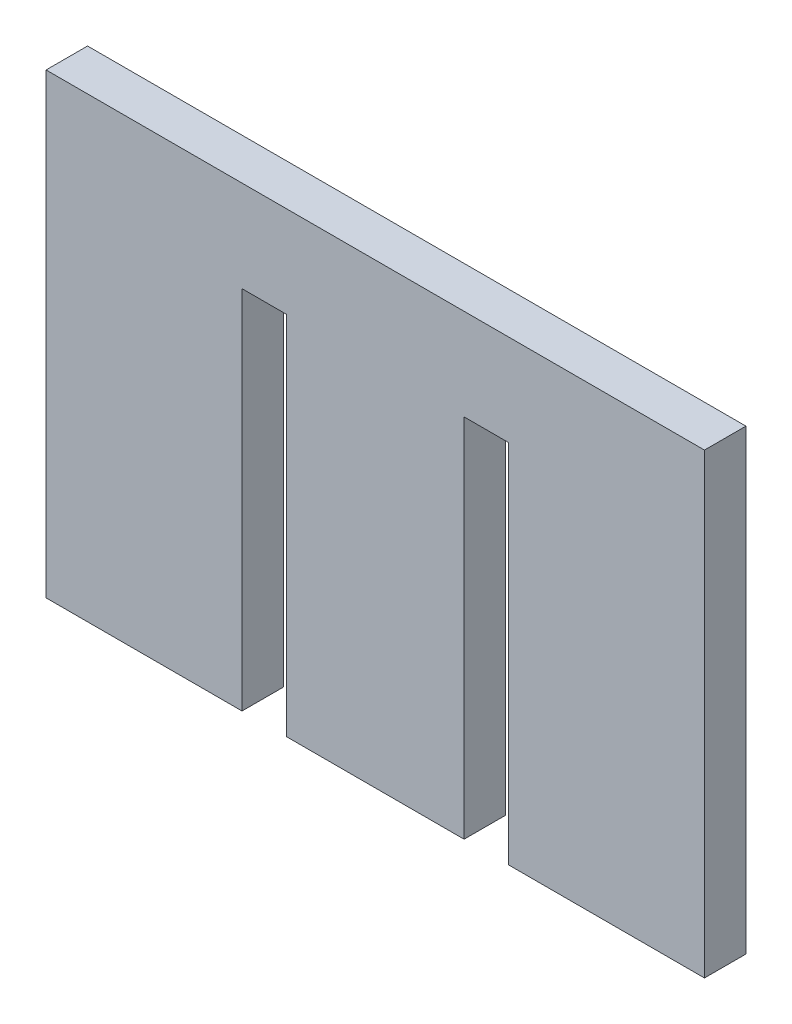
ISO-10303-21;
HEADER;
FILE_DESCRIPTION(('STEP AP214'),'2;1');
FILE_NAME('part.step','',(''),(''),'','','');
FILE_SCHEMA(('AUTOMOTIVE_DESIGN { 1 0 10303 214 1 1 1 1 }'));
ENDSEC;
DATA;
#1=APPLICATION_CONTEXT('core data for automotive mechanical design processes');
#2=APPLICATION_PROTOCOL_DEFINITION('international standard','automotive_design',2000,#1);
#3=PRODUCT_CONTEXT('',#1,'mechanical');
#4=PRODUCT('Part','Part','',(#3));
#5=PRODUCT_RELATED_PRODUCT_CATEGORY('part','',(#4));
#6=PRODUCT_DEFINITION_FORMATION('','',#4);
#7=PRODUCT_DEFINITION_CONTEXT('part definition',#1,'design');
#8=PRODUCT_DEFINITION('design','',#6,#7);
#9=PRODUCT_DEFINITION_SHAPE('','',#8);
#10=(LENGTH_UNIT() NAMED_UNIT(*) SI_UNIT(.MILLI.,.METRE.));
#11=(NAMED_UNIT(*) PLANE_ANGLE_UNIT() SI_UNIT($,.RADIAN.));
#12=(NAMED_UNIT(*) SI_UNIT($,.STERADIAN.) SOLID_ANGLE_UNIT());
#13=UNCERTAINTY_MEASURE_WITH_UNIT(LENGTH_MEASURE(1.E-05),#10,'distance_accuracy_value','');
#14=(GEOMETRIC_REPRESENTATION_CONTEXT(3) GLOBAL_UNCERTAINTY_ASSIGNED_CONTEXT((#13)) GLOBAL_UNIT_ASSIGNED_CONTEXT((#10,
#11,#12)) REPRESENTATION_CONTEXT('',''));
#15=CARTESIAN_POINT('',(0.,0.,0.));
#16=DIRECTION('',(0.,0.,1.));
#17=DIRECTION('',(1.,0.,0.));
#18=AXIS2_PLACEMENT_3D('',#15,#16,#17);
#19=CARTESIAN_POINT('',(15.,0.,3.175));
#20=DIRECTION('',(0.,1.,0.));
#21=DIRECTION('',(0.,0.,1.));
#22=AXIS2_PLACEMENT_3D('',#19,#20,#21);
#23=PLANE('',#22);
#24=DIRECTION('',(1.,0.,0.));
#25=VECTOR('',#24,1.);
#26=CARTESIAN_POINT('',(15.,0.,0.));
#27=LINE('',#26,#25);
#28=CARTESIAN_POINT('',(0.,0.,0.));
#29=VERTEX_POINT('',#28);
#30=CARTESIAN_POINT('',(15.,0.,0.));
#31=VERTEX_POINT('',#30);
#32=EDGE_CURVE('E153',#29,#31,#27,.T.);
#33=ORIENTED_EDGE('',*,*,#32,.T.);
#34=DIRECTION('',(0.,0.,-1.));
#35=VECTOR('',#34,1.);
#36=CARTESIAN_POINT('',(15.,0.,3.175));
#37=LINE('',#36,#35);
#38=CARTESIAN_POINT('',(15.,0.,3.175));
#39=VERTEX_POINT('',#38);
#40=EDGE_CURVE('E11',#39,#31,#37,.T.);
#41=ORIENTED_EDGE('',*,*,#40,.F.);
#42=DIRECTION('',(1.,0.,0.));
#43=VECTOR('',#42,1.);
#44=CARTESIAN_POINT('',(15.,0.,3.175));
#45=LINE('',#44,#43);
#46=CARTESIAN_POINT('',(0.,0.,3.175));
#47=VERTEX_POINT('',#46);
#48=EDGE_CURVE('E175',#47,#39,#45,.T.);
#49=ORIENTED_EDGE('',*,*,#48,.F.);
#50=DIRECTION('',(0.,0.,-1.));
#51=VECTOR('',#50,1.);
#52=CARTESIAN_POINT('',(0.,0.,3.175));
#53=LINE('',#52,#51);
#54=EDGE_CURVE('E149',#47,#29,#53,.T.);
#55=ORIENTED_EDGE('',*,*,#54,.T.);
#56=EDGE_LOOP('',(#33,#41,#49,#55));
#57=FACE_BOUND('',#56,.T.);
#58=ADVANCED_FACE('F33',(#57),#23,.F.);
#59=CARTESIAN_POINT('',(15.,28.,3.175));
#60=DIRECTION('',(-1.,0.,0.));
#61=DIRECTION('',(0.,-1.,0.));
#62=AXIS2_PLACEMENT_3D('',#59,#60,#61);
#63=PLANE('',#62);
#64=DIRECTION('',(0.,1.,0.));
#65=VECTOR('',#64,1.);
#66=CARTESIAN_POINT('',(15.,28.,0.));
#67=LINE('',#66,#65);
#68=CARTESIAN_POINT('',(15.,28.,0.));
#69=VERTEX_POINT('',#68);
#70=EDGE_CURVE('E156',#31,#69,#67,.T.);
#71=ORIENTED_EDGE('',*,*,#70,.T.);
#72=DIRECTION('',(0.,0.,-1.));
#73=VECTOR('',#72,1.);
#74=CARTESIAN_POINT('',(15.,28.,3.175));
#75=LINE('',#74,#73);
#76=CARTESIAN_POINT('',(15.,28.,3.175));
#77=VERTEX_POINT('',#76);
#78=EDGE_CURVE('E41',#77,#69,#75,.T.);
#79=ORIENTED_EDGE('',*,*,#78,.F.);
#80=DIRECTION('',(0.,1.,0.));
#81=VECTOR('',#80,1.);
#82=CARTESIAN_POINT('',(15.,28.,3.175));
#83=LINE('',#82,#81);
#84=EDGE_CURVE('E104',#39,#77,#83,.T.);
#85=ORIENTED_EDGE('',*,*,#84,.F.);
#86=ORIENTED_EDGE('',*,*,#40,.T.);
#87=EDGE_LOOP('',(#71,#79,#85,#86));
#88=FACE_BOUND('',#87,.T.);
#89=ADVANCED_FACE('F253',(#88),#63,.F.);
#90=CARTESIAN_POINT('',(18.4,28.,3.175));
#91=DIRECTION('',(0.,1.,0.));
#92=DIRECTION('',(-1.,0.,0.));
#93=AXIS2_PLACEMENT_3D('',#90,#91,#92);
#94=PLANE('',#93);
#95=DIRECTION('',(1.,0.,0.));
#96=VECTOR('',#95,1.);
#97=CARTESIAN_POINT('',(18.4,28.,0.));
#98=LINE('',#97,#96);
#99=CARTESIAN_POINT('',(18.4,28.,0.));
#100=VERTEX_POINT('',#99);
#101=EDGE_CURVE('E158',#69,#100,#98,.T.);
#102=ORIENTED_EDGE('',*,*,#101,.T.);
#103=DIRECTION('',(0.,0.,-1.));
#104=VECTOR('',#103,1.);
#105=CARTESIAN_POINT('',(18.4,28.,3.175));
#106=LINE('',#105,#104);
#107=CARTESIAN_POINT('',(18.4,28.,3.175));
#108=VERTEX_POINT('',#107);
#109=EDGE_CURVE('E194',#108,#100,#106,.T.);
#110=ORIENTED_EDGE('',*,*,#109,.F.);
#111=DIRECTION('',(1.,0.,0.));
#112=VECTOR('',#111,1.);
#113=CARTESIAN_POINT('',(18.4,28.,3.175));
#114=LINE('',#113,#112);
#115=EDGE_CURVE('E202',#77,#108,#114,.T.);
#116=ORIENTED_EDGE('',*,*,#115,.F.);
#117=ORIENTED_EDGE('',*,*,#78,.T.);
#118=EDGE_LOOP('',(#102,#110,#116,#117));
#119=FACE_BOUND('',#118,.T.);
#120=ADVANCED_FACE('F200',(#119),#94,.F.);
#121=CARTESIAN_POINT('',(18.4,0.,3.175));
#122=DIRECTION('',(1.,0.,0.));
#123=DIRECTION('',(0.,0.,-1.));
#124=AXIS2_PLACEMENT_3D('',#121,#122,#123);
#125=PLANE('',#124);
#126=DIRECTION('',(0.,-1.,0.));
#127=VECTOR('',#126,1.);
#128=CARTESIAN_POINT('',(18.4,0.,0.));
#129=LINE('',#128,#127);
#130=CARTESIAN_POINT('',(18.4,0.,0.));
#131=VERTEX_POINT('',#130);
#132=EDGE_CURVE('E160',#100,#131,#129,.T.);
#133=ORIENTED_EDGE('',*,*,#132,.T.);
#134=DIRECTION('',(0.,0.,-1.));
#135=VECTOR('',#134,1.);
#136=CARTESIAN_POINT('',(18.4,0.,3.175));
#137=LINE('',#136,#135);
#138=CARTESIAN_POINT('',(18.4,0.,3.175));
#139=VERTEX_POINT('',#138);
#140=EDGE_CURVE('E191',#139,#131,#137,.T.);
#141=ORIENTED_EDGE('',*,*,#140,.F.);
#142=DIRECTION('',(0.,-1.,0.));
#143=VECTOR('',#142,1.);
#144=CARTESIAN_POINT('',(18.4,0.,3.175));
#145=LINE('',#144,#143);
#146=EDGE_CURVE('E220',#108,#139,#145,.T.);
#147=ORIENTED_EDGE('',*,*,#146,.F.);
#148=ORIENTED_EDGE('',*,*,#109,.T.);
#149=EDGE_LOOP('',(#133,#141,#147,#148));
#150=FACE_BOUND('',#149,.T.);
#151=ADVANCED_FACE('F211',(#150),#125,.F.);
#152=CARTESIAN_POINT('',(32.,0.,3.175));
#153=DIRECTION('',(0.,1.,0.));
#154=DIRECTION('',(0.,0.,1.));
#155=AXIS2_PLACEMENT_3D('',#152,#153,#154);
#156=PLANE('',#155);
#157=DIRECTION('',(1.,0.,0.));
#158=VECTOR('',#157,1.);
#159=CARTESIAN_POINT('',(32.,0.,0.));
#160=LINE('',#159,#158);
#161=CARTESIAN_POINT('',(32.,0.,0.));
#162=VERTEX_POINT('',#161);
#163=EDGE_CURVE('E162',#131,#162,#160,.T.);
#164=ORIENTED_EDGE('',*,*,#163,.T.);
#165=DIRECTION('',(0.,0.,-1.));
#166=VECTOR('',#165,1.);
#167=CARTESIAN_POINT('',(32.,0.,3.175));
#168=LINE('',#167,#166);
#169=CARTESIAN_POINT('',(32.,0.,3.175));
#170=VERTEX_POINT('',#169);
#171=EDGE_CURVE('E188',#170,#162,#168,.T.);
#172=ORIENTED_EDGE('',*,*,#171,.F.);
#173=DIRECTION('',(1.,0.,0.));
#174=VECTOR('',#173,1.);
#175=CARTESIAN_POINT('',(32.,0.,3.175));
#176=LINE('',#175,#174);
#177=EDGE_CURVE('E217',#139,#170,#176,.T.);
#178=ORIENTED_EDGE('',*,*,#177,.F.);
#179=ORIENTED_EDGE('',*,*,#140,.T.);
#180=EDGE_LOOP('',(#164,#172,#178,#179));
#181=FACE_BOUND('',#180,.T.);
#182=ADVANCED_FACE('F215',(#181),#156,.F.);
#183=CARTESIAN_POINT('',(32.,28.,3.175));
#184=DIRECTION('',(-1.,0.,0.));
#185=DIRECTION('',(0.,0.,1.));
#186=AXIS2_PLACEMENT_3D('',#183,#184,#185);
#187=PLANE('',#186);
#188=DIRECTION('',(0.,1.,0.));
#189=VECTOR('',#188,1.);
#190=CARTESIAN_POINT('',(32.,28.,0.));
#191=LINE('',#190,#189);
#192=CARTESIAN_POINT('',(32.,28.,0.));
#193=VERTEX_POINT('',#192);
#194=EDGE_CURVE('E164',#162,#193,#191,.T.);
#195=ORIENTED_EDGE('',*,*,#194,.T.);
#196=DIRECTION('',(0.,0.,-1.));
#197=VECTOR('',#196,1.);
#198=CARTESIAN_POINT('',(32.,28.,3.175));
#199=LINE('',#198,#197);
#200=CARTESIAN_POINT('',(32.,28.,3.175));
#201=VERTEX_POINT('',#200);
#202=EDGE_CURVE('E185',#201,#193,#199,.T.);
#203=ORIENTED_EDGE('',*,*,#202,.F.);
#204=DIRECTION('',(0.,1.,0.));
#205=VECTOR('',#204,1.);
#206=CARTESIAN_POINT('',(32.,28.,3.175));
#207=LINE('',#206,#205);
#208=EDGE_CURVE('E219',#170,#201,#207,.T.);
#209=ORIENTED_EDGE('',*,*,#208,.F.);
#210=ORIENTED_EDGE('',*,*,#171,.T.);
#211=EDGE_LOOP('',(#195,#203,#209,#210));
#212=FACE_BOUND('',#211,.T.);
#213=ADVANCED_FACE('F266',(#212),#187,.F.);
#214=CARTESIAN_POINT('',(35.4,28.,3.175));
#215=DIRECTION('',(0.,1.,0.));
#216=DIRECTION('',(0.,0.,1.));
#217=AXIS2_PLACEMENT_3D('',#214,#215,#216);
#218=PLANE('',#217);
#219=DIRECTION('',(1.,0.,0.));
#220=VECTOR('',#219,1.);
#221=CARTESIAN_POINT('',(35.4,28.,0.));
#222=LINE('',#221,#220);
#223=CARTESIAN_POINT('',(35.4,28.,0.));
#224=VERTEX_POINT('',#223);
#225=EDGE_CURVE('E166',#193,#224,#222,.T.);
#226=ORIENTED_EDGE('',*,*,#225,.T.);
#227=DIRECTION('',(0.,0.,-1.));
#228=VECTOR('',#227,1.);
#229=CARTESIAN_POINT('',(35.4,28.,3.175));
#230=LINE('',#229,#228);
#231=CARTESIAN_POINT('',(35.4,28.,3.175));
#232=VERTEX_POINT('',#231);
#233=EDGE_CURVE('E182',#232,#224,#230,.T.);
#234=ORIENTED_EDGE('',*,*,#233,.F.);
#235=DIRECTION('',(1.,0.,0.));
#236=VECTOR('',#235,1.);
#237=CARTESIAN_POINT('',(35.4,28.,3.175));
#238=LINE('',#237,#236);
#239=EDGE_CURVE('E222',#201,#232,#238,.T.);
#240=ORIENTED_EDGE('',*,*,#239,.F.);
#241=ORIENTED_EDGE('',*,*,#202,.T.);
#242=EDGE_LOOP('',(#226,#234,#240,#241));
#243=FACE_BOUND('',#242,.T.);
#244=ADVANCED_FACE('F269',(#243),#218,.F.);
#245=CARTESIAN_POINT('',(35.4,0.,3.175));
#246=DIRECTION('',(1.,0.,0.));
#247=DIRECTION('',(0.,0.,-1.));
#248=AXIS2_PLACEMENT_3D('',#245,#246,#247);
#249=PLANE('',#248);
#250=DIRECTION('',(0.,-1.,0.));
#251=VECTOR('',#250,1.);
#252=CARTESIAN_POINT('',(35.4,0.,0.));
#253=LINE('',#252,#251);
#254=CARTESIAN_POINT('',(35.4,0.,0.));
#255=VERTEX_POINT('',#254);
#256=EDGE_CURVE('E168',#224,#255,#253,.T.);
#257=ORIENTED_EDGE('',*,*,#256,.T.);
#258=DIRECTION('',(0.,0.,-1.));
#259=VECTOR('',#258,1.);
#260=CARTESIAN_POINT('',(35.4,0.,3.175));
#261=LINE('',#260,#259);
#262=CARTESIAN_POINT('',(35.4,0.,3.175));
#263=VERTEX_POINT('',#262);
#264=EDGE_CURVE('E179',#263,#255,#261,.T.);
#265=ORIENTED_EDGE('',*,*,#264,.F.);
#266=DIRECTION('',(0.,-1.,0.));
#267=VECTOR('',#266,1.);
#268=CARTESIAN_POINT('',(35.4,0.,3.175));
#269=LINE('',#268,#267);
#270=EDGE_CURVE('E228',#232,#263,#269,.T.);
#271=ORIENTED_EDGE('',*,*,#270,.F.);
#272=ORIENTED_EDGE('',*,*,#233,.T.);
#273=EDGE_LOOP('',(#257,#265,#271,#272));
#274=FACE_BOUND('',#273,.T.);
#275=ADVANCED_FACE('F234',(#274),#249,.F.);
#276=CARTESIAN_POINT('',(50.4,0.,3.175));
#277=DIRECTION('',(0.,1.,0.));
#278=DIRECTION('',(-1.,0.,0.));
#279=AXIS2_PLACEMENT_3D('',#276,#277,#278);
#280=PLANE('',#279);
#281=DIRECTION('',(1.,0.,0.));
#282=VECTOR('',#281,1.);
#283=CARTESIAN_POINT('',(50.4,0.,0.));
#284=LINE('',#283,#282);
#285=CARTESIAN_POINT('',(50.4,0.,0.));
#286=VERTEX_POINT('',#285);
#287=EDGE_CURVE('E170',#255,#286,#284,.T.);
#288=ORIENTED_EDGE('',*,*,#287,.T.);
#289=DIRECTION('',(0.,0.,-1.));
#290=VECTOR('',#289,1.);
#291=CARTESIAN_POINT('',(50.4,0.,3.175));
#292=LINE('',#291,#290);
#293=CARTESIAN_POINT('',(50.4,0.,3.175));
#294=VERTEX_POINT('',#293);
#295=EDGE_CURVE('E144',#294,#286,#292,.T.);
#296=ORIENTED_EDGE('',*,*,#295,.F.);
#297=DIRECTION('',(1.,0.,0.));
#298=VECTOR('',#297,1.);
#299=CARTESIAN_POINT('',(50.4,0.,3.175));
#300=LINE('',#299,#298);
#301=EDGE_CURVE('E135',#263,#294,#300,.T.);
#302=ORIENTED_EDGE('',*,*,#301,.F.);
#303=ORIENTED_EDGE('',*,*,#264,.T.);
#304=EDGE_LOOP('',(#288,#296,#302,#303));
#305=FACE_BOUND('',#304,.T.);
#306=ADVANCED_FACE('F238',(#305),#280,.F.);
#307=CARTESIAN_POINT('',(50.4,35.,3.175));
#308=DIRECTION('',(-1.,0.,0.));
#309=DIRECTION('',(0.,-1.,0.));
#310=AXIS2_PLACEMENT_3D('',#307,#308,#309);
#311=PLANE('',#310);
#312=DIRECTION('',(0.,1.,0.));
#313=VECTOR('',#312,1.);
#314=CARTESIAN_POINT('',(50.4,35.,0.));
#315=LINE('',#314,#313);
#316=CARTESIAN_POINT('',(50.4,35.,0.));
#317=VERTEX_POINT('',#316);
#318=EDGE_CURVE('E143',#286,#317,#315,.T.);
#319=ORIENTED_EDGE('',*,*,#318,.T.);
#320=DIRECTION('',(0.,0.,-1.));
#321=VECTOR('',#320,1.);
#322=CARTESIAN_POINT('',(50.4,35.,3.175));
#323=LINE('',#322,#321);
#324=CARTESIAN_POINT('',(50.4,35.,3.175));
#325=VERTEX_POINT('',#324);
#326=EDGE_CURVE('E140',#325,#317,#323,.T.);
#327=ORIENTED_EDGE('',*,*,#326,.F.);
#328=DIRECTION('',(0.,1.,0.));
#329=VECTOR('',#328,1.);
#330=CARTESIAN_POINT('',(50.4,35.,3.175));
#331=LINE('',#330,#329);
#332=EDGE_CURVE('E129',#294,#325,#331,.T.);
#333=ORIENTED_EDGE('',*,*,#332,.F.);
#334=ORIENTED_EDGE('',*,*,#295,.T.);
#335=EDGE_LOOP('',(#319,#327,#333,#334));
#336=FACE_BOUND('',#335,.T.);
#337=ADVANCED_FACE('F141',(#336),#311,.F.);
#338=CARTESIAN_POINT('',(0.,35.,3.175));
#339=DIRECTION('',(0.,-1.,0.));
#340=DIRECTION('',(0.,0.,-1.));
#341=AXIS2_PLACEMENT_3D('',#338,#339,#340);
#342=PLANE('',#341);
#343=DIRECTION('',(-1.,0.,0.));
#344=VECTOR('',#343,1.);
#345=CARTESIAN_POINT('',(0.,35.,0.));
#346=LINE('',#345,#344);
#347=CARTESIAN_POINT('',(0.,35.,0.));
#348=VERTEX_POINT('',#347);
#349=EDGE_CURVE('E90',#317,#348,#346,.T.);
#350=ORIENTED_EDGE('',*,*,#349,.T.);
#351=DIRECTION('',(0.,0.,-1.));
#352=VECTOR('',#351,1.);
#353=CARTESIAN_POINT('',(0.,35.,3.175));
#354=LINE('',#353,#352);
#355=CARTESIAN_POINT('',(0.,35.,3.175));
#356=VERTEX_POINT('',#355);
#357=EDGE_CURVE('E145',#356,#348,#354,.T.);
#358=ORIENTED_EDGE('',*,*,#357,.F.);
#359=DIRECTION('',(-1.,0.,0.));
#360=VECTOR('',#359,1.);
#361=CARTESIAN_POINT('',(0.,35.,3.175));
#362=LINE('',#361,#360);
#363=EDGE_CURVE('E133',#325,#356,#362,.T.);
#364=ORIENTED_EDGE('',*,*,#363,.F.);
#365=ORIENTED_EDGE('',*,*,#326,.T.);
#366=EDGE_LOOP('',(#350,#358,#364,#365));
#367=FACE_BOUND('',#366,.T.);
#368=ADVANCED_FACE('F147',(#367),#342,.F.);
#369=CARTESIAN_POINT('',(0.,0.,3.175));
#370=DIRECTION('',(1.,0.,0.));
#371=DIRECTION('',(0.,0.,-1.));
#372=AXIS2_PLACEMENT_3D('',#369,#370,#371);
#373=PLANE('',#372);
#374=DIRECTION('',(0.,-1.,0.));
#375=VECTOR('',#374,1.);
#376=CARTESIAN_POINT('',(0.,0.,0.));
#377=LINE('',#376,#375);
#378=EDGE_CURVE('E96',#348,#29,#377,.T.);
#379=ORIENTED_EDGE('',*,*,#378,.T.);
#380=ORIENTED_EDGE('',*,*,#54,.F.);
#381=DIRECTION('',(0.,-1.,0.));
#382=VECTOR('',#381,1.);
#383=CARTESIAN_POINT('',(0.,0.,3.175));
#384=LINE('',#383,#382);
#385=EDGE_CURVE('E49',#356,#47,#384,.T.);
#386=ORIENTED_EDGE('',*,*,#385,.F.);
#387=ORIENTED_EDGE('',*,*,#357,.T.);
#388=EDGE_LOOP('',(#379,#380,#386,#387));
#389=FACE_BOUND('',#388,.T.);
#390=ADVANCED_FACE('F242',(#389),#373,.F.);
#391=CARTESIAN_POINT('',(0.,0.,3.175));
#392=DIRECTION('',(0.,0.,-1.));
#393=DIRECTION('',(-1.,0.,0.));
#394=AXIS2_PLACEMENT_3D('',#391,#392,#393);
#395=PLANE('',#394);
#396=ORIENTED_EDGE('',*,*,#48,.T.);
#397=ORIENTED_EDGE('',*,*,#84,.T.);
#398=ORIENTED_EDGE('',*,*,#115,.T.);
#399=ORIENTED_EDGE('',*,*,#146,.T.);
#400=ORIENTED_EDGE('',*,*,#177,.T.);
#401=ORIENTED_EDGE('',*,*,#208,.T.);
#402=ORIENTED_EDGE('',*,*,#239,.T.);
#403=ORIENTED_EDGE('',*,*,#270,.T.);
#404=ORIENTED_EDGE('',*,*,#301,.T.);
#405=ORIENTED_EDGE('',*,*,#332,.T.);
#406=ORIENTED_EDGE('',*,*,#363,.T.);
#407=ORIENTED_EDGE('',*,*,#385,.T.);
#408=EDGE_LOOP('',(#396,#397,#398,#399,#400,#401,#402,#403,#404,#405,#406,#407));
#409=FACE_BOUND('',#408,.T.);
#410=ADVANCED_FACE('F131',(#409),#395,.F.);
#411=CARTESIAN_POINT('',(0.,0.,0.));
#412=DIRECTION('',(0.,0.,-1.));
#413=DIRECTION('',(-1.,0.,0.));
#414=AXIS2_PLACEMENT_3D('',#411,#412,#413);
#415=PLANE('',#414);
#416=ORIENTED_EDGE('',*,*,#32,.F.);
#417=ORIENTED_EDGE('',*,*,#378,.F.);
#418=ORIENTED_EDGE('',*,*,#349,.F.);
#419=ORIENTED_EDGE('',*,*,#318,.F.);
#420=ORIENTED_EDGE('',*,*,#287,.F.);
#421=ORIENTED_EDGE('',*,*,#256,.F.);
#422=ORIENTED_EDGE('',*,*,#225,.F.);
#423=ORIENTED_EDGE('',*,*,#194,.F.);
#424=ORIENTED_EDGE('',*,*,#163,.F.);
#425=ORIENTED_EDGE('',*,*,#132,.F.);
#426=ORIENTED_EDGE('',*,*,#101,.F.);
#427=ORIENTED_EDGE('',*,*,#70,.F.);
#428=EDGE_LOOP('',(#416,#417,#418,#419,#420,#421,#422,#423,#424,#425,#426,#427));
#429=FACE_BOUND('',#428,.T.);
#430=ADVANCED_FACE('F206',(#429),#415,.T.);
#431=CLOSED_SHELL('',(#58,#89,#120,#151,#182,#213,#244,#275,#306,#337,#368,#390,#410,#430));
#432=MANIFOLD_SOLID_BREP('B2',#431);
#433=ADVANCED_BREP_SHAPE_REPRESENTATION('',(#18,#432),#14);
#434=SHAPE_DEFINITION_REPRESENTATION(#9,#433);
ENDSEC;
END-ISO-10303-21;
